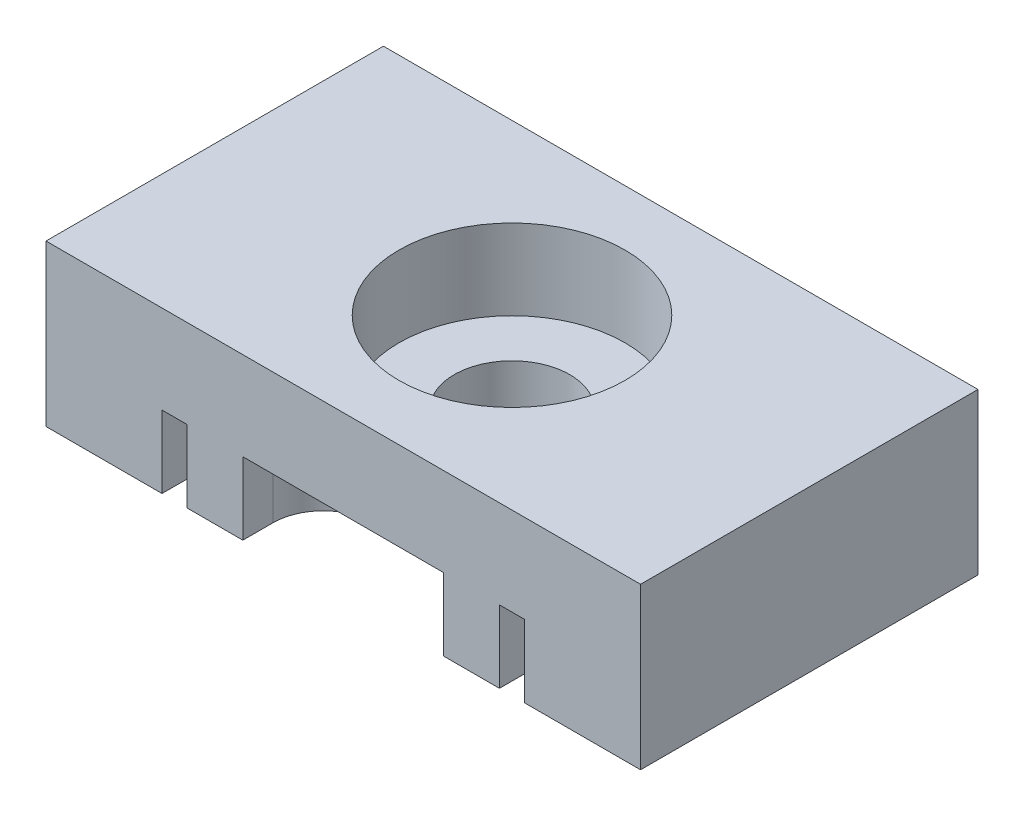
ISO-10303-21;
HEADER;
FILE_DESCRIPTION(('STEP AP214'),'2;1');
FILE_NAME('part.step','',(''),(''),'','','');
FILE_SCHEMA(('AUTOMOTIVE_DESIGN { 1 0 10303 214 1 1 1 1 }'));
ENDSEC;
DATA;
#1=APPLICATION_CONTEXT('core data for automotive mechanical design processes');
#2=APPLICATION_PROTOCOL_DEFINITION('international standard','automotive_design',2000,#1);
#3=PRODUCT_CONTEXT('',#1,'mechanical');
#4=PRODUCT('Part','Part','',(#3));
#5=PRODUCT_RELATED_PRODUCT_CATEGORY('part','',(#4));
#6=PRODUCT_DEFINITION_FORMATION('','',#4);
#7=PRODUCT_DEFINITION_CONTEXT('part definition',#1,'design');
#8=PRODUCT_DEFINITION('design','',#6,#7);
#9=PRODUCT_DEFINITION_SHAPE('','',#8);
#10=(LENGTH_UNIT() NAMED_UNIT(*) SI_UNIT(.MILLI.,.METRE.));
#11=(NAMED_UNIT(*) PLANE_ANGLE_UNIT() SI_UNIT($,.RADIAN.));
#12=(NAMED_UNIT(*) SI_UNIT($,.STERADIAN.) SOLID_ANGLE_UNIT());
#13=UNCERTAINTY_MEASURE_WITH_UNIT(LENGTH_MEASURE(1.E-05),#10,'distance_accuracy_value','');
#14=(GEOMETRIC_REPRESENTATION_CONTEXT(3) GLOBAL_UNCERTAINTY_ASSIGNED_CONTEXT((#13)) GLOBAL_UNIT_ASSIGNED_CONTEXT((#10,
#11,#12)) REPRESENTATION_CONTEXT('',''));
#15=CARTESIAN_POINT('',(0.,0.,0.));
#16=DIRECTION('',(0.,0.,1.));
#17=DIRECTION('',(1.,0.,0.));
#18=AXIS2_PLACEMENT_3D('',#15,#16,#17);
#19=CARTESIAN_POINT('',(9.398,5.08,5.334));
#20=DIRECTION('',(-1.,0.,0.));
#21=DIRECTION('',(0.,0.,1.));
#22=AXIS2_PLACEMENT_3D('',#19,#20,#21);
#23=PLANE('',#22);
#24=DIRECTION('',(0.,0.,-1.));
#25=VECTOR('',#24,1.);
#26=CARTESIAN_POINT('',(9.398,0.,5.334));
#27=LINE('',#26,#25);
#28=CARTESIAN_POINT('',(9.398,0.,5.334));
#29=VERTEX_POINT('',#28);
#30=CARTESIAN_POINT('',(9.398,0.,-5.334));
#31=VERTEX_POINT('',#30);
#32=EDGE_CURVE('E268',#29,#31,#27,.T.);
#33=ORIENTED_EDGE('',*,*,#32,.T.);
#34=DIRECTION('',(0.,-1.,0.));
#35=VECTOR('',#34,1.);
#36=CARTESIAN_POINT('',(9.398,5.08,-5.334));
#37=LINE('',#36,#35);
#38=CARTESIAN_POINT('',(9.398,5.08,-5.334));
#39=VERTEX_POINT('',#38);
#40=EDGE_CURVE('E303',#39,#31,#37,.T.);
#41=ORIENTED_EDGE('',*,*,#40,.F.);
#42=DIRECTION('',(0.,0.,-1.));
#43=VECTOR('',#42,1.);
#44=CARTESIAN_POINT('',(9.398,5.08,5.334));
#45=LINE('',#44,#43);
#46=CARTESIAN_POINT('',(9.398,5.08,5.334));
#47=VERTEX_POINT('',#46);
#48=EDGE_CURVE('E274',#47,#39,#45,.T.);
#49=ORIENTED_EDGE('',*,*,#48,.F.);
#50=DIRECTION('',(0.,-1.,0.));
#51=VECTOR('',#50,1.);
#52=CARTESIAN_POINT('',(9.398,5.08,5.334));
#53=LINE('',#52,#51);
#54=EDGE_CURVE('E284',#47,#29,#53,.T.);
#55=ORIENTED_EDGE('',*,*,#54,.T.);
#56=EDGE_LOOP('',(#33,#41,#49,#55));
#57=FACE_BOUND('',#56,.T.);
#58=ADVANCED_FACE('F34',(#57),#23,.F.);
#59=CARTESIAN_POINT('',(-9.398,5.08,-5.334));
#60=DIRECTION('',(0.,0.,1.));
#61=DIRECTION('',(1.,0.,0.));
#62=AXIS2_PLACEMENT_3D('',#59,#60,#61);
#63=PLANE('',#62);
#64=DIRECTION('',(-1.,0.,0.));
#65=VECTOR('',#64,1.);
#66=CARTESIAN_POINT('',(-9.398,0.,-5.334));
#67=LINE('',#66,#65);
#68=CARTESIAN_POINT('',(-9.398,0.,-5.334));
#69=VERTEX_POINT('',#68);
#70=EDGE_CURVE('E287',#31,#69,#67,.T.);
#71=ORIENTED_EDGE('',*,*,#70,.T.);
#72=DIRECTION('',(0.,-1.,0.));
#73=VECTOR('',#72,1.);
#74=CARTESIAN_POINT('',(-9.398,5.08,-5.334));
#75=LINE('',#74,#73);
#76=CARTESIAN_POINT('',(-9.398,5.08,-5.334));
#77=VERTEX_POINT('',#76);
#78=EDGE_CURVE('E300',#77,#69,#75,.T.);
#79=ORIENTED_EDGE('',*,*,#78,.F.);
#80=DIRECTION('',(-1.,0.,0.));
#81=VECTOR('',#80,1.);
#82=CARTESIAN_POINT('',(-9.398,5.08,-5.334));
#83=LINE('',#82,#81);
#84=EDGE_CURVE('E277',#39,#77,#83,.T.);
#85=ORIENTED_EDGE('',*,*,#84,.F.);
#86=ORIENTED_EDGE('',*,*,#40,.T.);
#87=EDGE_LOOP('',(#71,#79,#85,#86));
#88=FACE_BOUND('',#87,.T.);
#89=ADVANCED_FACE('F341',(#88),#63,.F.);
#90=CARTESIAN_POINT('',(-9.398,5.08,5.334));
#91=DIRECTION('',(1.,0.,0.));
#92=DIRECTION('',(0.,0.,-1.));
#93=AXIS2_PLACEMENT_3D('',#90,#91,#92);
#94=PLANE('',#93);
#95=DIRECTION('',(0.,0.,1.));
#96=VECTOR('',#95,1.);
#97=CARTESIAN_POINT('',(-9.398,0.,5.334));
#98=LINE('',#97,#96);
#99=CARTESIAN_POINT('',(-9.398,0.,5.334));
#100=VERTEX_POINT('',#99);
#101=EDGE_CURVE('E289',#69,#100,#98,.T.);
#102=ORIENTED_EDGE('',*,*,#101,.T.);
#103=DIRECTION('',(0.,-1.,0.));
#104=VECTOR('',#103,1.);
#105=CARTESIAN_POINT('',(-9.398,5.08,5.334));
#106=LINE('',#105,#104);
#107=CARTESIAN_POINT('',(-9.398,5.08,5.334));
#108=VERTEX_POINT('',#107);
#109=EDGE_CURVE('E297',#108,#100,#106,.T.);
#110=ORIENTED_EDGE('',*,*,#109,.F.);
#111=DIRECTION('',(0.,0.,1.));
#112=VECTOR('',#111,1.);
#113=CARTESIAN_POINT('',(-9.398,5.08,5.334));
#114=LINE('',#113,#112);
#115=EDGE_CURVE('E280',#77,#108,#114,.T.);
#116=ORIENTED_EDGE('',*,*,#115,.F.);
#117=ORIENTED_EDGE('',*,*,#78,.T.);
#118=EDGE_LOOP('',(#102,#110,#116,#117));
#119=FACE_BOUND('',#118,.T.);
#120=ADVANCED_FACE('F346',(#119),#94,.F.);
#121=CARTESIAN_POINT('',(-9.398,5.08,5.334));
#122=DIRECTION('',(0.,0.,-1.));
#123=DIRECTION('',(-1.,0.,0.));
#124=AXIS2_PLACEMENT_3D('',#121,#122,#123);
#125=PLANE('',#124);
#126=DIRECTION('',(1.,0.,0.));
#127=VECTOR('',#126,1.);
#128=CARTESIAN_POINT('',(-9.398,0.,5.334));
#129=LINE('',#128,#127);
#130=CARTESIAN_POINT('',(-4.937125,0.,5.334));
#131=VERTEX_POINT('',#130);
#132=CARTESIAN_POINT('',(-3.175,0.,5.334));
#133=VERTEX_POINT('',#132);
#134=EDGE_CURVE('E294',#131,#133,#129,.T.);
#135=ORIENTED_EDGE('',*,*,#134,.T.);
#136=DIRECTION('',(0.,-1.,0.));
#137=VECTOR('',#136,1.);
#138=CARTESIAN_POINT('',(-3.175,2.286,5.334));
#139=LINE('',#138,#137);
#140=CARTESIAN_POINT('',(-3.175,2.286,5.334));
#141=VERTEX_POINT('',#140);
#142=EDGE_CURVE('E200',#141,#133,#139,.T.);
#143=ORIENTED_EDGE('',*,*,#142,.F.);
#144=DIRECTION('',(-1.,0.,0.));
#145=VECTOR('',#144,1.);
#146=CARTESIAN_POINT('',(-3.175,2.286,5.334));
#147=LINE('',#146,#145);
#148=CARTESIAN_POINT('',(3.175,2.286,5.334));
#149=VERTEX_POINT('',#148);
#150=EDGE_CURVE('E166',#149,#141,#147,.T.);
#151=ORIENTED_EDGE('',*,*,#150,.F.);
#152=DIRECTION('',(0.,-1.,0.));
#153=VECTOR('',#152,1.);
#154=CARTESIAN_POINT('',(3.175,2.286,5.334));
#155=LINE('',#154,#153);
#156=CARTESIAN_POINT('',(3.175,0.,5.334));
#157=VERTEX_POINT('',#156);
#158=EDGE_CURVE('E203',#149,#157,#155,.T.);
#159=ORIENTED_EDGE('',*,*,#158,.T.);
#160=CARTESIAN_POINT('',(4.937125,0.,5.334));
#161=VERTEX_POINT('',#160);
#162=EDGE_CURVE('E56',#157,#161,#129,.T.);
#163=ORIENTED_EDGE('',*,*,#162,.T.);
#164=DIRECTION('',(0.,-1.,0.));
#165=VECTOR('',#164,1.);
#166=CARTESIAN_POINT('',(4.937125,2.286,5.334));
#167=LINE('',#166,#165);
#168=CARTESIAN_POINT('',(4.937125,2.286,5.334));
#169=VERTEX_POINT('',#168);
#170=EDGE_CURVE('E232',#169,#161,#167,.T.);
#171=ORIENTED_EDGE('',*,*,#170,.F.);
#172=DIRECTION('',(-1.,0.,0.));
#173=VECTOR('',#172,1.);
#174=CARTESIAN_POINT('',(-9.398,2.286,5.334));
#175=LINE('',#174,#173);
#176=CARTESIAN_POINT('',(5.730875,2.286,5.334));
#177=VERTEX_POINT('',#176);
#178=EDGE_CURVE('E11',#177,#169,#175,.T.);
#179=ORIENTED_EDGE('',*,*,#178,.F.);
#180=DIRECTION('',(0.,-1.,0.));
#181=VECTOR('',#180,1.);
#182=CARTESIAN_POINT('',(5.730875,2.286,5.334));
#183=LINE('',#182,#181);
#184=CARTESIAN_POINT('',(5.730875,0.,5.334));
#185=VERTEX_POINT('',#184);
#186=EDGE_CURVE('E239',#177,#185,#183,.T.);
#187=ORIENTED_EDGE('',*,*,#186,.T.);
#188=EDGE_CURVE('E291',#185,#29,#129,.T.);
#189=ORIENTED_EDGE('',*,*,#188,.T.);
#190=ORIENTED_EDGE('',*,*,#54,.F.);
#191=DIRECTION('',(1.,0.,0.));
#192=VECTOR('',#191,1.);
#193=CARTESIAN_POINT('',(-9.398,5.08,5.334));
#194=LINE('',#193,#192);
#195=EDGE_CURVE('E282',#108,#47,#194,.T.);
#196=ORIENTED_EDGE('',*,*,#195,.F.);
#197=ORIENTED_EDGE('',*,*,#109,.T.);
#198=CARTESIAN_POINT('',(-5.730875,0.,5.334));
#199=VERTEX_POINT('',#198);
#200=EDGE_CURVE('E278',#100,#199,#129,.T.);
#201=ORIENTED_EDGE('',*,*,#200,.T.);
#202=DIRECTION('',(0.,-1.,0.));
#203=VECTOR('',#202,1.);
#204=CARTESIAN_POINT('',(-5.730875,2.286,5.334));
#205=LINE('',#204,#203);
#206=CARTESIAN_POINT('',(-5.730875,2.286,5.334));
#207=VERTEX_POINT('',#206);
#208=EDGE_CURVE('E258',#207,#199,#205,.T.);
#209=ORIENTED_EDGE('',*,*,#208,.F.);
#210=DIRECTION('',(-1.,0.,0.));
#211=VECTOR('',#210,1.);
#212=CARTESIAN_POINT('',(-9.398,2.286,5.334));
#213=LINE('',#212,#211);
#214=CARTESIAN_POINT('',(-4.937125,2.286,5.334));
#215=VERTEX_POINT('',#214);
#216=EDGE_CURVE('E41',#215,#207,#213,.T.);
#217=ORIENTED_EDGE('',*,*,#216,.F.);
#218=DIRECTION('',(0.,-1.,0.));
#219=VECTOR('',#218,1.);
#220=CARTESIAN_POINT('',(-4.937125,2.286,5.334));
#221=LINE('',#220,#219);
#222=EDGE_CURVE('E265',#215,#131,#221,.T.);
#223=ORIENTED_EDGE('',*,*,#222,.T.);
#224=EDGE_LOOP('',(#135,#143,#151,#159,#163,#171,#179,#187,#189,#190,#196,#197,#201,#209,#217,#223));
#225=FACE_BOUND('',#224,.T.);
#226=ADVANCED_FACE('F316',(#225),#125,.F.);
#227=CARTESIAN_POINT('',(0.,5.08,0.));
#228=DIRECTION('',(0.,-1.,0.));
#229=DIRECTION('',(0.,0.,-1.));
#230=AXIS2_PLACEMENT_3D('',#227,#228,#229);
#231=PLANE('',#230);
#232=CARTESIAN_POINT('',(0.,5.08,0.));
#233=DIRECTION('',(0.,1.,0.));
#234=DIRECTION('',(0.,0.,1.));
#235=AXIS2_PLACEMENT_3D('',#232,#233,#234);
#236=CIRCLE('',#235,3.57250999999999);
#237=CARTESIAN_POINT('',(0.,5.08,3.57250999999999));
#238=VERTEX_POINT('',#237);
#239=EDGE_CURVE('E202',#238,#238,#236,.T.);
#240=ORIENTED_EDGE('',*,*,#239,.F.);
#241=EDGE_LOOP('',(#240));
#242=FACE_BOUND('',#241,.T.);
#243=ORIENTED_EDGE('',*,*,#48,.T.);
#244=ORIENTED_EDGE('',*,*,#84,.T.);
#245=ORIENTED_EDGE('',*,*,#115,.T.);
#246=ORIENTED_EDGE('',*,*,#195,.T.);
#247=EDGE_LOOP('',(#243,#244,#245,#246));
#248=FACE_BOUND('',#247,.T.);
#249=ADVANCED_FACE('F344',(#242,#248),#231,.F.);
#250=CARTESIAN_POINT('',(0.,0.,0.));
#251=DIRECTION('',(0.,-1.,0.));
#252=DIRECTION('',(0.,0.,-1.));
#253=AXIS2_PLACEMENT_3D('',#250,#251,#252);
#254=PLANE('',#253);
#255=DIRECTION('',(0.,0.,-1.));
#256=VECTOR('',#255,1.);
#257=CARTESIAN_POINT('',(-3.175,0.,5.334));
#258=LINE('',#257,#256);
#259=CARTESIAN_POINT('',(-3.175,0.,4.38150000000001));
#260=VERTEX_POINT('',#259);
#261=EDGE_CURVE('E48',#133,#260,#258,.T.);
#262=ORIENTED_EDGE('',*,*,#261,.F.);
#263=ORIENTED_EDGE('',*,*,#134,.F.);
#264=DIRECTION('',(0.,0.,1.));
#265=VECTOR('',#264,1.);
#266=CARTESIAN_POINT('',(-4.937125,0.,5.334));
#267=LINE('',#266,#265);
#268=CARTESIAN_POINT('',(-4.937125,0.,3.8608));
#269=VERTEX_POINT('',#268);
#270=EDGE_CURVE('E252',#269,#131,#267,.T.);
#271=ORIENTED_EDGE('',*,*,#270,.F.);
#272=CARTESIAN_POINT('',(-5.334,0.,3.8608));
#273=DIRECTION('',(0.,-1.,0.));
#274=DIRECTION('',(0.,0.,-1.));
#275=AXIS2_PLACEMENT_3D('',#272,#273,#274);
#276=CIRCLE('',#275,0.396875);
#277=CARTESIAN_POINT('',(-5.730875,0.,3.8608));
#278=VERTEX_POINT('',#277);
#279=EDGE_CURVE('E261',#278,#269,#276,.T.);
#280=ORIENTED_EDGE('',*,*,#279,.F.);
#281=DIRECTION('',(0.,0.,-1.));
#282=VECTOR('',#281,1.);
#283=CARTESIAN_POINT('',(-5.730875,0.,5.334));
#284=LINE('',#283,#282);
#285=EDGE_CURVE('E242',#199,#278,#284,.T.);
#286=ORIENTED_EDGE('',*,*,#285,.F.);
#287=ORIENTED_EDGE('',*,*,#200,.F.);
#288=ORIENTED_EDGE('',*,*,#101,.F.);
#289=ORIENTED_EDGE('',*,*,#70,.F.);
#290=ORIENTED_EDGE('',*,*,#32,.F.);
#291=ORIENTED_EDGE('',*,*,#188,.F.);
#292=DIRECTION('',(0.,0.,1.));
#293=VECTOR('',#292,1.);
#294=CARTESIAN_POINT('',(5.730875,0.,5.334));
#295=LINE('',#294,#293);
#296=CARTESIAN_POINT('',(5.730875,0.,3.8608));
#297=VERTEX_POINT('',#296);
#298=EDGE_CURVE('E226',#297,#185,#295,.T.);
#299=ORIENTED_EDGE('',*,*,#298,.F.);
#300=CARTESIAN_POINT('',(5.334,0.,3.8608));
#301=DIRECTION('',(0.,-1.,0.));
#302=DIRECTION('',(0.,0.,-1.));
#303=AXIS2_PLACEMENT_3D('',#300,#301,#302);
#304=CIRCLE('',#303,0.396875);
#305=CARTESIAN_POINT('',(4.937125,0.,3.8608));
#306=VERTEX_POINT('',#305);
#307=EDGE_CURVE('E235',#306,#297,#304,.T.);
#308=ORIENTED_EDGE('',*,*,#307,.F.);
#309=DIRECTION('',(0.,0.,-1.));
#310=VECTOR('',#309,1.);
#311=CARTESIAN_POINT('',(4.937125,0.,5.334));
#312=LINE('',#311,#310);
#313=EDGE_CURVE('E221',#161,#306,#312,.T.);
#314=ORIENTED_EDGE('',*,*,#313,.F.);
#315=ORIENTED_EDGE('',*,*,#162,.F.);
#316=DIRECTION('',(0.,0.,1.));
#317=VECTOR('',#316,1.);
#318=CARTESIAN_POINT('',(3.175,0.,5.334));
#319=LINE('',#318,#317);
#320=CARTESIAN_POINT('',(3.175,0.,4.38150000000001));
#321=VERTEX_POINT('',#320);
#322=EDGE_CURVE('E180',#321,#157,#319,.T.);
#323=ORIENTED_EDGE('',*,*,#322,.F.);
#324=CARTESIAN_POINT('',(1.5875,0.,4.3815));
#325=DIRECTION('',(0.,-1.,0.));
#326=DIRECTION('',(0.,0.,-1.));
#327=AXIS2_PLACEMENT_3D('',#324,#325,#326);
#328=CIRCLE('',#327,1.5875);
#329=CARTESIAN_POINT('',(1.58749999999999,0.,2.794));
#330=VERTEX_POINT('',#329);
#331=EDGE_CURVE('E182',#330,#321,#328,.T.);
#332=ORIENTED_EDGE('',*,*,#331,.F.);
#333=DIRECTION('',(1.,0.,0.));
#334=VECTOR('',#333,1.);
#335=CARTESIAN_POINT('',(-1.58749999999999,0.,2.794));
#336=LINE('',#335,#334);
#337=CARTESIAN_POINT('',(-1.58749999999999,0.,2.794));
#338=VERTEX_POINT('',#337);
#339=EDGE_CURVE('E195',#338,#330,#336,.T.);
#340=ORIENTED_EDGE('',*,*,#339,.F.);
#341=CARTESIAN_POINT('',(-1.5875,0.,4.3815));
#342=DIRECTION('',(0.,-1.,0.));
#343=DIRECTION('',(0.,0.,1.));
#344=AXIS2_PLACEMENT_3D('',#341,#342,#343);
#345=CIRCLE('',#344,1.5875);
#346=EDGE_CURVE('E193',#260,#338,#345,.T.);
#347=ORIENTED_EDGE('',*,*,#346,.F.);
#348=EDGE_LOOP('',(#262,#263,#271,#280,#286,#287,#288,#289,#290,#291,#299,#308,#314,#315,#323,
#332,#340,#347));
#349=FACE_BOUND('',#348,.T.);
#350=CARTESIAN_POINT('',(0.,0.,0.));
#351=DIRECTION('',(0.,1.,0.));
#352=DIRECTION('',(0.,0.,1.));
#353=AXIS2_PLACEMENT_3D('',#350,#351,#352);
#354=CIRCLE('',#353,1.8288);
#355=CARTESIAN_POINT('',(0.,0.,1.8288));
#356=VERTEX_POINT('',#355);
#357=EDGE_CURVE('E218',#356,#356,#354,.T.);
#358=ORIENTED_EDGE('',*,*,#357,.T.);
#359=EDGE_LOOP('',(#358));
#360=FACE_BOUND('',#359,.T.);
#361=ADVANCED_FACE('F322',(#349,#360),#254,.T.);
#362=CARTESIAN_POINT('',(-5.334,2.286,5.334));
#363=DIRECTION('',(0.,-1.,0.));
#364=DIRECTION('',(0.,0.,-1.));
#365=AXIS2_PLACEMENT_3D('',#362,#363,#364);
#366=PLANE('',#365);
#367=ORIENTED_EDGE('',*,*,#216,.T.);
#368=DIRECTION('',(0.,0.,-1.));
#369=VECTOR('',#368,1.);
#370=CARTESIAN_POINT('',(-5.730875,2.286,5.334));
#371=LINE('',#370,#369);
#372=CARTESIAN_POINT('',(-5.730875,2.286,3.8608));
#373=VERTEX_POINT('',#372);
#374=EDGE_CURVE('E248',#207,#373,#371,.T.);
#375=ORIENTED_EDGE('',*,*,#374,.T.);
#376=CARTESIAN_POINT('',(-5.334,2.286,3.8608));
#377=DIRECTION('',(0.,-1.,0.));
#378=DIRECTION('',(0.,0.,-1.));
#379=AXIS2_PLACEMENT_3D('',#376,#377,#378);
#380=CIRCLE('',#379,0.396875);
#381=CARTESIAN_POINT('',(-4.937125,2.286,3.8608));
#382=VERTEX_POINT('',#381);
#383=EDGE_CURVE('E251',#373,#382,#380,.T.);
#384=ORIENTED_EDGE('',*,*,#383,.T.);
#385=DIRECTION('',(0.,0.,1.));
#386=VECTOR('',#385,1.);
#387=CARTESIAN_POINT('',(-4.937125,2.286,5.334));
#388=LINE('',#387,#386);
#389=EDGE_CURVE('E255',#382,#215,#388,.T.);
#390=ORIENTED_EDGE('',*,*,#389,.T.);
#391=EDGE_LOOP('',(#367,#375,#384,#390));
#392=FACE_BOUND('',#391,.T.);
#393=ADVANCED_FACE('F308',(#392),#366,.T.);
#394=CARTESIAN_POINT('',(-4.937125,2.286,5.334));
#395=DIRECTION('',(1.,0.,0.));
#396=DIRECTION('',(0.,0.,-1.));
#397=AXIS2_PLACEMENT_3D('',#394,#395,#396);
#398=PLANE('',#397);
#399=ORIENTED_EDGE('',*,*,#270,.T.);
#400=ORIENTED_EDGE('',*,*,#222,.F.);
#401=ORIENTED_EDGE('',*,*,#389,.F.);
#402=DIRECTION('',(0.,-1.,0.));
#403=VECTOR('',#402,1.);
#404=CARTESIAN_POINT('',(-4.937125,2.286,3.8608));
#405=LINE('',#404,#403);
#406=EDGE_CURVE('E269',#382,#269,#405,.T.);
#407=ORIENTED_EDGE('',*,*,#406,.T.);
#408=EDGE_LOOP('',(#399,#400,#401,#407));
#409=FACE_BOUND('',#408,.T.);
#410=ADVANCED_FACE('F330',(#409),#398,.F.);
#411=CARTESIAN_POINT('',(-5.334,2.286,3.8608));
#412=DIRECTION('',(0.,-1.,0.));
#413=DIRECTION('',(0.,0.,-1.));
#414=AXIS2_PLACEMENT_3D('',#411,#412,#413);
#415=CYLINDRICAL_SURFACE('',#414,0.396875);
#416=ORIENTED_EDGE('',*,*,#279,.T.);
#417=ORIENTED_EDGE('',*,*,#406,.F.);
#418=ORIENTED_EDGE('',*,*,#383,.F.);
#419=DIRECTION('',(0.,-1.,0.));
#420=VECTOR('',#419,1.);
#421=CARTESIAN_POINT('',(-5.730875,2.286,3.8608));
#422=LINE('',#421,#420);
#423=EDGE_CURVE('E271',#373,#278,#422,.T.);
#424=ORIENTED_EDGE('',*,*,#423,.T.);
#425=EDGE_LOOP('',(#416,#417,#418,#424));
#426=FACE_BOUND('',#425,.T.);
#427=ADVANCED_FACE('F328',(#426),#415,.F.);
#428=CARTESIAN_POINT('',(-5.730875,2.286,5.334));
#429=DIRECTION('',(-1.,0.,0.));
#430=DIRECTION('',(0.,0.,1.));
#431=AXIS2_PLACEMENT_3D('',#428,#429,#430);
#432=PLANE('',#431);
#433=ORIENTED_EDGE('',*,*,#285,.T.);
#434=ORIENTED_EDGE('',*,*,#423,.F.);
#435=ORIENTED_EDGE('',*,*,#374,.F.);
#436=ORIENTED_EDGE('',*,*,#208,.T.);
#437=EDGE_LOOP('',(#433,#434,#435,#436));
#438=FACE_BOUND('',#437,.T.);
#439=ADVANCED_FACE('F312',(#438),#432,.F.);
#440=CARTESIAN_POINT('',(5.334,2.286,5.334));
#441=DIRECTION('',(0.,-1.,0.));
#442=DIRECTION('',(0.,0.,-1.));
#443=AXIS2_PLACEMENT_3D('',#440,#441,#442);
#444=PLANE('',#443);
#445=ORIENTED_EDGE('',*,*,#178,.T.);
#446=DIRECTION('',(0.,0.,-1.));
#447=VECTOR('',#446,1.);
#448=CARTESIAN_POINT('',(4.937125,2.286,5.334));
#449=LINE('',#448,#447);
#450=CARTESIAN_POINT('',(4.937125,2.286,3.8608));
#451=VERTEX_POINT('',#450);
#452=EDGE_CURVE('E222',#169,#451,#449,.T.);
#453=ORIENTED_EDGE('',*,*,#452,.T.);
#454=CARTESIAN_POINT('',(5.334,2.286,3.8608));
#455=DIRECTION('',(0.,-1.,0.));
#456=DIRECTION('',(0.,0.,-1.));
#457=AXIS2_PLACEMENT_3D('',#454,#455,#456);
#458=CIRCLE('',#457,0.396875);
#459=CARTESIAN_POINT('',(5.730875,2.286,3.8608));
#460=VERTEX_POINT('',#459);
#461=EDGE_CURVE('E225',#451,#460,#458,.T.);
#462=ORIENTED_EDGE('',*,*,#461,.T.);
#463=DIRECTION('',(0.,0.,1.));
#464=VECTOR('',#463,1.);
#465=CARTESIAN_POINT('',(5.730875,2.286,5.334));
#466=LINE('',#465,#464);
#467=EDGE_CURVE('E229',#460,#177,#466,.T.);
#468=ORIENTED_EDGE('',*,*,#467,.T.);
#469=EDGE_LOOP('',(#445,#453,#462,#468));
#470=FACE_BOUND('',#469,.T.);
#471=ADVANCED_FACE('F403',(#470),#444,.T.);
#472=CARTESIAN_POINT('',(5.730875,2.286,5.334));
#473=DIRECTION('',(1.,0.,0.));
#474=DIRECTION('',(0.,0.,-1.));
#475=AXIS2_PLACEMENT_3D('',#472,#473,#474);
#476=PLANE('',#475);
#477=ORIENTED_EDGE('',*,*,#298,.T.);
#478=ORIENTED_EDGE('',*,*,#186,.F.);
#479=ORIENTED_EDGE('',*,*,#467,.F.);
#480=DIRECTION('',(0.,-1.,0.));
#481=VECTOR('',#480,1.);
#482=CARTESIAN_POINT('',(5.730875,2.286,3.8608));
#483=LINE('',#482,#481);
#484=EDGE_CURVE('E243',#460,#297,#483,.T.);
#485=ORIENTED_EDGE('',*,*,#484,.T.);
#486=EDGE_LOOP('',(#477,#478,#479,#485));
#487=FACE_BOUND('',#486,.T.);
#488=ADVANCED_FACE('F412',(#487),#476,.F.);
#489=CARTESIAN_POINT('',(5.334,2.286,3.8608));
#490=DIRECTION('',(0.,-1.,0.));
#491=DIRECTION('',(0.,0.,-1.));
#492=AXIS2_PLACEMENT_3D('',#489,#490,#491);
#493=CYLINDRICAL_SURFACE('',#492,0.396875);
#494=ORIENTED_EDGE('',*,*,#307,.T.);
#495=ORIENTED_EDGE('',*,*,#484,.F.);
#496=ORIENTED_EDGE('',*,*,#461,.F.);
#497=DIRECTION('',(0.,-1.,0.));
#498=VECTOR('',#497,1.);
#499=CARTESIAN_POINT('',(4.937125,2.286,3.8608));
#500=LINE('',#499,#498);
#501=EDGE_CURVE('E245',#451,#306,#500,.T.);
#502=ORIENTED_EDGE('',*,*,#501,.T.);
#503=EDGE_LOOP('',(#494,#495,#496,#502));
#504=FACE_BOUND('',#503,.T.);
#505=ADVANCED_FACE('F422',(#504),#493,.F.);
#506=CARTESIAN_POINT('',(4.937125,2.286,5.334));
#507=DIRECTION('',(-1.,0.,0.));
#508=DIRECTION('',(0.,0.,1.));
#509=AXIS2_PLACEMENT_3D('',#506,#507,#508);
#510=PLANE('',#509);
#511=ORIENTED_EDGE('',*,*,#313,.T.);
#512=ORIENTED_EDGE('',*,*,#501,.F.);
#513=ORIENTED_EDGE('',*,*,#452,.F.);
#514=ORIENTED_EDGE('',*,*,#170,.T.);
#515=EDGE_LOOP('',(#511,#512,#513,#514));
#516=FACE_BOUND('',#515,.T.);
#517=ADVANCED_FACE('F432',(#516),#510,.F.);
#518=CARTESIAN_POINT('',(0.,5.08,0.));
#519=DIRECTION('',(0.,1.,0.));
#520=DIRECTION('',(0.,0.,1.));
#521=AXIS2_PLACEMENT_3D('',#518,#519,#520);
#522=CYLINDRICAL_SURFACE('',#521,1.8288);
#523=ORIENTED_EDGE('',*,*,#357,.F.);
#524=EDGE_LOOP('',(#523));
#525=FACE_BOUND('',#524,.T.);
#526=CARTESIAN_POINT('',(0.,2.54,0.));
#527=DIRECTION('',(0.,1.,0.));
#528=DIRECTION('',(0.,0.,1.));
#529=AXIS2_PLACEMENT_3D('',#526,#527,#528);
#530=CIRCLE('',#529,1.8288);
#531=CARTESIAN_POINT('',(0.,2.54,1.8288));
#532=VERTEX_POINT('',#531);
#533=EDGE_CURVE('E215',#532,#532,#530,.T.);
#534=ORIENTED_EDGE('',*,*,#533,.T.);
#535=EDGE_LOOP('',(#534));
#536=FACE_BOUND('',#535,.T.);
#537=ADVANCED_FACE('F442',(#525,#536),#522,.F.);
#538=CARTESIAN_POINT('',(1.8288,2.54,0.));
#539=DIRECTION('',(0.,-1.,0.));
#540=DIRECTION('',(0.,0.,-1.));
#541=AXIS2_PLACEMENT_3D('',#538,#539,#540);
#542=PLANE('',#541);
#543=ORIENTED_EDGE('',*,*,#533,.F.);
#544=EDGE_LOOP('',(#543));
#545=FACE_BOUND('',#544,.T.);
#546=CARTESIAN_POINT('',(0.,2.54,0.));
#547=DIRECTION('',(0.,1.,0.));
#548=DIRECTION('',(0.,0.,1.));
#549=AXIS2_PLACEMENT_3D('',#546,#547,#548);
#550=CIRCLE('',#549,3.57251);
#551=CARTESIAN_POINT('',(0.,2.54,3.57251));
#552=VERTEX_POINT('',#551);
#553=EDGE_CURVE('E212',#552,#552,#550,.T.);
#554=ORIENTED_EDGE('',*,*,#553,.T.);
#555=EDGE_LOOP('',(#554));
#556=FACE_BOUND('',#555,.T.);
#557=ADVANCED_FACE('F461',(#545,#556),#542,.F.);
#558=CARTESIAN_POINT('',(0.,5.08,0.));
#559=DIRECTION('',(0.,1.,0.));
#560=DIRECTION('',(0.,0.,1.));
#561=AXIS2_PLACEMENT_3D('',#558,#559,#560);
#562=CYLINDRICAL_SURFACE('',#561,3.57251);
#563=ORIENTED_EDGE('',*,*,#553,.F.);
#564=EDGE_LOOP('',(#563));
#565=FACE_BOUND('',#564,.T.);
#566=ORIENTED_EDGE('',*,*,#239,.T.);
#567=EDGE_LOOP('',(#566));
#568=FACE_BOUND('',#567,.T.);
#569=ADVANCED_FACE('F471',(#565,#568),#562,.F.);
#570=CARTESIAN_POINT('',(-3.175,2.286,5.334));
#571=DIRECTION('',(-1.,0.,0.));
#572=DIRECTION('',(0.,0.,1.));
#573=AXIS2_PLACEMENT_3D('',#570,#571,#572);
#574=PLANE('',#573);
#575=ORIENTED_EDGE('',*,*,#261,.T.);
#576=DIRECTION('',(0.,-1.,0.));
#577=VECTOR('',#576,1.);
#578=CARTESIAN_POINT('',(-3.175,2.286,4.38150000000001));
#579=LINE('',#578,#577);
#580=CARTESIAN_POINT('',(-3.175,2.286,4.38150000000001));
#581=VERTEX_POINT('',#580);
#582=EDGE_CURVE('E156',#581,#260,#579,.T.);
#583=ORIENTED_EDGE('',*,*,#582,.F.);
#584=DIRECTION('',(0.,0.,-1.));
#585=VECTOR('',#584,1.);
#586=CARTESIAN_POINT('',(-3.175,2.286,5.334));
#587=LINE('',#586,#585);
#588=EDGE_CURVE('E160',#141,#581,#587,.T.);
#589=ORIENTED_EDGE('',*,*,#588,.F.);
#590=ORIENTED_EDGE('',*,*,#142,.T.);
#591=EDGE_LOOP('',(#575,#583,#589,#590));
#592=FACE_BOUND('',#591,.T.);
#593=ADVANCED_FACE('F158',(#592),#574,.F.);
#594=CARTESIAN_POINT('',(3.175,2.286,5.334));
#595=DIRECTION('',(1.,0.,0.));
#596=DIRECTION('',(0.,0.,-1.));
#597=AXIS2_PLACEMENT_3D('',#594,#595,#596);
#598=PLANE('',#597);
#599=ORIENTED_EDGE('',*,*,#322,.T.);
#600=ORIENTED_EDGE('',*,*,#158,.F.);
#601=DIRECTION('',(0.,0.,1.));
#602=VECTOR('',#601,1.);
#603=CARTESIAN_POINT('',(3.175,2.286,5.334));
#604=LINE('',#603,#602);
#605=CARTESIAN_POINT('',(3.175,2.286,4.38150000000001));
#606=VERTEX_POINT('',#605);
#607=EDGE_CURVE('E189',#606,#149,#604,.T.);
#608=ORIENTED_EDGE('',*,*,#607,.F.);
#609=DIRECTION('',(0.,-1.,0.));
#610=VECTOR('',#609,1.);
#611=CARTESIAN_POINT('',(3.175,2.286,4.38150000000001));
#612=LINE('',#611,#610);
#613=EDGE_CURVE('E205',#606,#321,#612,.T.);
#614=ORIENTED_EDGE('',*,*,#613,.T.);
#615=EDGE_LOOP('',(#599,#600,#608,#614));
#616=FACE_BOUND('',#615,.T.);
#617=ADVANCED_FACE('F501',(#616),#598,.F.);
#618=CARTESIAN_POINT('',(1.5875,2.286,4.3815));
#619=DIRECTION('',(0.,-1.,0.));
#620=DIRECTION('',(0.,0.,-1.));
#621=AXIS2_PLACEMENT_3D('',#618,#619,#620);
#622=CYLINDRICAL_SURFACE('',#621,1.5875);
#623=ORIENTED_EDGE('',*,*,#331,.T.);
#624=ORIENTED_EDGE('',*,*,#613,.F.);
#625=CARTESIAN_POINT('',(1.5875,2.286,4.3815));
#626=DIRECTION('',(0.,-1.,0.));
#627=DIRECTION('',(0.,0.,-1.));
#628=AXIS2_PLACEMENT_3D('',#625,#626,#627);
#629=CIRCLE('',#628,1.5875);
#630=CARTESIAN_POINT('',(1.58749999999999,2.286,2.794));
#631=VERTEX_POINT('',#630);
#632=EDGE_CURVE('E186',#631,#606,#629,.T.);
#633=ORIENTED_EDGE('',*,*,#632,.F.);
#634=DIRECTION('',(0.,-1.,0.));
#635=VECTOR('',#634,1.);
#636=CARTESIAN_POINT('',(1.58749999999999,2.286,2.794));
#637=LINE('',#636,#635);
#638=EDGE_CURVE('E207',#631,#330,#637,.T.);
#639=ORIENTED_EDGE('',*,*,#638,.T.);
#640=EDGE_LOOP('',(#623,#624,#633,#639));
#641=FACE_BOUND('',#640,.T.);
#642=ADVANCED_FACE('F510',(#641),#622,.F.);
#643=CARTESIAN_POINT('',(-1.58749999999999,2.286,2.794));
#644=DIRECTION('',(0.,0.,-1.));
#645=DIRECTION('',(-1.,0.,0.));
#646=AXIS2_PLACEMENT_3D('',#643,#644,#645);
#647=PLANE('',#646);
#648=ORIENTED_EDGE('',*,*,#339,.T.);
#649=ORIENTED_EDGE('',*,*,#638,.F.);
#650=DIRECTION('',(1.,0.,0.));
#651=VECTOR('',#650,1.);
#652=CARTESIAN_POINT('',(-1.58749999999999,2.286,2.794));
#653=LINE('',#652,#651);
#654=CARTESIAN_POINT('',(-1.58749999999999,2.286,2.794));
#655=VERTEX_POINT('',#654);
#656=EDGE_CURVE('E174',#655,#631,#653,.T.);
#657=ORIENTED_EDGE('',*,*,#656,.F.);
#658=DIRECTION('',(0.,-1.,0.));
#659=VECTOR('',#658,1.);
#660=CARTESIAN_POINT('',(-1.58749999999999,2.286,2.794));
#661=LINE('',#660,#659);
#662=EDGE_CURVE('E165',#655,#338,#661,.T.);
#663=ORIENTED_EDGE('',*,*,#662,.T.);
#664=EDGE_LOOP('',(#648,#649,#657,#663));
#665=FACE_BOUND('',#664,.T.);
#666=ADVANCED_FACE('F520',(#665),#647,.F.);
#667=CARTESIAN_POINT('',(-1.5875,2.286,4.3815));
#668=DIRECTION('',(0.,-1.,0.));
#669=DIRECTION('',(0.,0.,-1.));
#670=AXIS2_PLACEMENT_3D('',#667,#668,#669);
#671=CYLINDRICAL_SURFACE('',#670,1.5875);
#672=ORIENTED_EDGE('',*,*,#346,.T.);
#673=ORIENTED_EDGE('',*,*,#662,.F.);
#674=CARTESIAN_POINT('',(-1.5875,2.286,4.3815));
#675=DIRECTION('',(0.,-1.,0.));
#676=DIRECTION('',(0.,0.,1.));
#677=AXIS2_PLACEMENT_3D('',#674,#675,#676);
#678=CIRCLE('',#677,1.5875);
#679=EDGE_CURVE('E169',#581,#655,#678,.T.);
#680=ORIENTED_EDGE('',*,*,#679,.F.);
#681=ORIENTED_EDGE('',*,*,#582,.T.);
#682=EDGE_LOOP('',(#672,#673,#680,#681));
#683=FACE_BOUND('',#682,.T.);
#684=ADVANCED_FACE('F170',(#683),#671,.F.);
#685=CARTESIAN_POINT('',(-1.5875,2.286,4.3815));
#686=DIRECTION('',(0.,1.,0.));
#687=DIRECTION('',(0.,0.,1.));
#688=AXIS2_PLACEMENT_3D('',#685,#686,#687);
#689=PLANE('',#688);
#690=ORIENTED_EDGE('',*,*,#588,.T.);
#691=ORIENTED_EDGE('',*,*,#679,.T.);
#692=ORIENTED_EDGE('',*,*,#656,.T.);
#693=ORIENTED_EDGE('',*,*,#632,.T.);
#694=ORIENTED_EDGE('',*,*,#607,.T.);
#695=ORIENTED_EDGE('',*,*,#150,.T.);
#696=EDGE_LOOP('',(#690,#691,#692,#693,#694,#695));
#697=FACE_BOUND('',#696,.T.);
#698=ADVANCED_FACE('F176',(#697),#689,.F.);
#699=CLOSED_SHELL('',(#58,#89,#120,#226,#249,#361,#393,#410,#427,#439,#471,#488,#505,#517,#537,
#557,#569,#593,#617,#642,#666,#684,#698));
#700=MANIFOLD_SOLID_BREP('B2',#699);
#701=ADVANCED_BREP_SHAPE_REPRESENTATION('',(#18,#700),#14);
#702=SHAPE_DEFINITION_REPRESENTATION(#9,#701);
ENDSEC;
END-ISO-10303-21;
